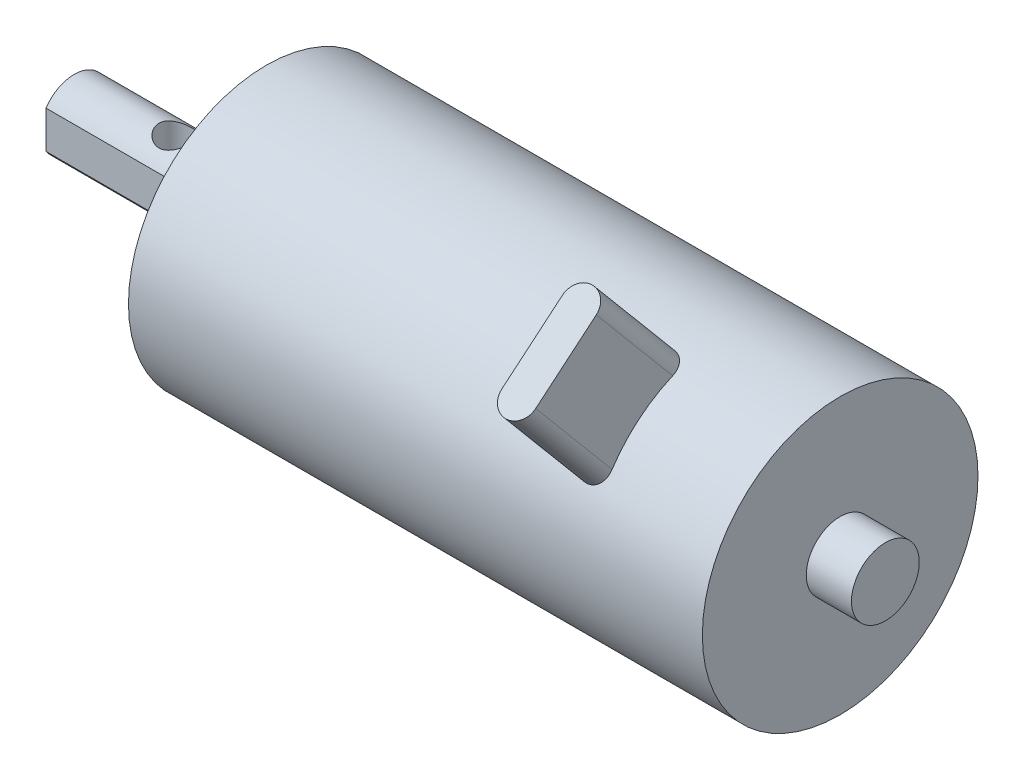
ISO-10303-21;
HEADER;
FILE_DESCRIPTION(('STEP AP214'),'2;1');
FILE_NAME('part.step','',(''),(''),'','','');
FILE_SCHEMA(('AUTOMOTIVE_DESIGN { 1 0 10303 214 1 1 1 1 }'));
ENDSEC;
DATA;
#1=APPLICATION_CONTEXT('core data for automotive mechanical design processes');
#2=APPLICATION_PROTOCOL_DEFINITION('international standard','automotive_design',2000,#1);
#3=PRODUCT_CONTEXT('',#1,'mechanical');
#4=PRODUCT('Part','Part','',(#3));
#5=PRODUCT_RELATED_PRODUCT_CATEGORY('part','',(#4));
#6=PRODUCT_DEFINITION_FORMATION('','',#4);
#7=PRODUCT_DEFINITION_CONTEXT('part definition',#1,'design');
#8=PRODUCT_DEFINITION('design','',#6,#7);
#9=PRODUCT_DEFINITION_SHAPE('','',#8);
#10=(LENGTH_UNIT() NAMED_UNIT(*) SI_UNIT(.MILLI.,.METRE.));
#11=(NAMED_UNIT(*) PLANE_ANGLE_UNIT() SI_UNIT($,.RADIAN.));
#12=(NAMED_UNIT(*) SI_UNIT($,.STERADIAN.) SOLID_ANGLE_UNIT());
#13=UNCERTAINTY_MEASURE_WITH_UNIT(LENGTH_MEASURE(1.E-05),#10,'distance_accuracy_value','');
#14=(GEOMETRIC_REPRESENTATION_CONTEXT(3) GLOBAL_UNCERTAINTY_ASSIGNED_CONTEXT((#13)) GLOBAL_UNIT_ASSIGNED_CONTEXT((#10,
#11,#12)) REPRESENTATION_CONTEXT('',''));
#15=CARTESIAN_POINT('',(0.,0.,0.));
#16=DIRECTION('',(0.,0.,1.));
#17=DIRECTION('',(1.,0.,0.));
#18=AXIS2_PLACEMENT_3D('',#15,#16,#17);
#19=CARTESIAN_POINT('',(-36.1518987341772,0.,0.));
#20=DIRECTION('',(-1.,0.,0.));
#21=DIRECTION('',(0.,0.,1.));
#22=AXIS2_PLACEMENT_3D('',#19,#20,#21);
#23=CYLINDRICAL_SURFACE('',#22,12.2);
#24=CARTESIAN_POINT('',(33.5686482187747,0.,0.));
#25=DIRECTION('',(-1.,0.,0.));
#26=DIRECTION('',(0.,0.,1.));
#27=AXIS2_PLACEMENT_3D('',#24,#25,#26);
#28=CIRCLE('',#27,12.2);
#29=CARTESIAN_POINT('',(33.5686482187747,0.,12.2));
#30=VERTEX_POINT('',#29);
#31=EDGE_CURVE('E168',#30,#30,#28,.T.);
#32=ORIENTED_EDGE('',*,*,#31,.T.);
#33=EDGE_LOOP('',(#32));
#34=FACE_BOUND('',#33,.T.);
#35=CARTESIAN_POINT('',(-17.2313517812253,0.,0.));
#36=DIRECTION('',(-1.,0.,0.));
#37=DIRECTION('',(0.,0.,1.));
#38=AXIS2_PLACEMENT_3D('',#35,#36,#37);
#39=CIRCLE('',#38,12.2);
#40=CARTESIAN_POINT('',(-17.2313517812253,0.,12.2));
#41=VERTEX_POINT('',#40);
#42=EDGE_CURVE('E171',#41,#41,#39,.T.);
#43=ORIENTED_EDGE('',*,*,#42,.F.);
#44=EDGE_LOOP('',(#43));
#45=FACE_BOUND('',#44,.T.);
#46=CARTESIAN_POINT('',(23.5686482187747,6.70313688125544,10.1935251974552));
#47=CARTESIAN_POINT('',(23.568647036408,6.66436642516747,10.2190219540229));
#48=CARTESIAN_POINT('',(23.5666712754832,6.62546962957114,10.2442809888455));
#49=CARTESIAN_POINT('',(23.5588239274405,6.54767741971779,10.2941755456539));
#50=CARTESIAN_POINT('',(23.552952960155,6.50878200622546,10.3188111661944));
#51=CARTESIAN_POINT('',(23.5295974692947,6.39256570298484,10.3915069588322));
#52=CARTESIAN_POINT('',(23.5063700508387,6.31560791400092,10.4384262158296));
#53=CARTESIAN_POINT('',(23.4453513214166,6.16512839330881,10.5280046016835));
#54=CARTESIAN_POINT('',(23.4075606179307,6.09160651842131,10.5706639081425));
#55=CARTESIAN_POINT('',(23.318335524122,5.95024076115301,10.6508797233694));
#56=CARTESIAN_POINT('',(23.2669006065871,5.88239709831147,10.6884360348728));
#57=CARTESIAN_POINT('',(23.1515120679318,5.75476626141769,10.757692495623));
#58=CARTESIAN_POINT('',(23.0875537312973,5.69498213643071,10.7893904302154));
#59=CARTESIAN_POINT('',(22.94859809677,5.58598704916432,10.8462222082018));
#60=CARTESIAN_POINT('',(22.8736019971563,5.53677494059261,10.8713567633073));
#61=CARTESIAN_POINT('',(22.7189595348809,5.45374127254246,10.9132377710523));
#62=CARTESIAN_POINT('',(22.6397887991631,5.41922754589515,10.9303664683995));
#63=CARTESIAN_POINT('',(22.4757607891449,5.36379340867553,10.9576772776205));
#64=CARTESIAN_POINT('',(22.3909145912908,5.34284732638927,10.96787251033));
#65=CARTESIAN_POINT('',(22.2657461958081,5.3231770625354,10.9774233804454));
#66=CARTESIAN_POINT('',(22.2264799880015,5.31856510500312,10.9796576135526));
#67=CARTESIAN_POINT('',(22.147699621081,5.3124112625009,10.9826360163077));
#68=CARTESIAN_POINT('',(22.1081858191756,5.31086567219003,10.9833819843535));
#69=CARTESIAN_POINT('',(22.0686482187747,5.3108666508632,10.9833826946323));
#70=B_SPLINE_CURVE_WITH_KNOTS('',3,(#46,#47,#48,#49,#50,#51,#52,#53,#54,#55,#56,#57,#58,#59,#60,
#61,#62,#63,#64,#65,#66,#67,#68,#69),.UNSPECIFIED.,.F.,.F.,(4,2,2,2,2,2,2,2,2,2,2,4),(0.,
0.139117984758654,0.27821383739904,0.556027022620829,0.833828620640015,1.11164095446973,
1.38955809641229,1.66744508939992,1.9301995855681,2.19245545309232,2.31112784927465,
2.42965675639252),.UNSPECIFIED.);
#71=CARTESIAN_POINT('',(23.5686482187747,6.70313688125544,10.1935251974552));
#72=VERTEX_POINT('',#71);
#73=CARTESIAN_POINT('',(22.0686482187747,5.3108666508632,10.9833826946323));
#74=VERTEX_POINT('',#73);
#75=EDGE_CURVE('E63',#72,#74,#70,.T.);
#76=ORIENTED_EDGE('',*,*,#75,.T.);
#77=CARTESIAN_POINT('',(22.0686482187747,5.3108666508632,10.9833826946323));
#78=CARTESIAN_POINT('',(22.0288737146961,5.31086404243873,10.9833826090815));
#79=CARTESIAN_POINT('',(21.9891196166211,5.31242924613729,10.9826272579866));
#80=CARTESIAN_POINT('',(21.9099228117034,5.31865455966664,10.9796143653024));
#81=CARTESIAN_POINT('',(21.870480020568,5.32331380044602,10.9773572455286));
#82=CARTESIAN_POINT('',(21.7533314460765,5.34181903892782,10.9683712377856));
#83=CARTESIAN_POINT('',(21.6764549668962,5.36019334620099,10.9594275027304));
#84=CARTESIAN_POINT('',(21.5273007518627,5.40808951007209,10.9358707218082));
#85=CARTESIAN_POINT('',(21.4550201926286,5.43760444388122,10.9212611965107));
#86=CARTESIAN_POINT('',(21.3166508316866,5.50646852247127,10.8867021861893));
#87=CARTESIAN_POINT('',(21.2505661223796,5.54582410501915,10.8667492048592));
#88=CARTESIAN_POINT('',(21.1233494466656,5.63469694781062,10.8209420672849));
#89=CARTESIAN_POINT('',(21.0625483221439,5.68457562771626,10.7948727597828));
#90=CARTESIAN_POINT('',(20.9503743105202,5.7916030232241,10.7378308228955));
#91=CARTESIAN_POINT('',(20.8990049397399,5.84875443683801,10.706856372771));
#92=CARTESIAN_POINT('',(20.8029754172839,5.97333305281737,10.6378918094933));
#93=CARTESIAN_POINT('',(20.759163569708,6.04121516401551,10.5995411035256));
#94=CARTESIAN_POINT('',(20.6845341424084,6.181340354576,10.5184402536808));
#95=CARTESIAN_POINT('',(20.6537149876935,6.25358290414591,10.4756906438266));
#96=CARTESIAN_POINT('',(20.6095933374536,6.38884108529308,10.3936482386368));
#97=CARTESIAN_POINT('',(20.594300384776,6.45152463123381,10.3548664623744));
#98=CARTESIAN_POINT('',(20.5738223666413,6.57730613486213,10.2754405821694));
#99=CARTESIAN_POINT('',(20.5686315566217,6.64040383654517,10.2347975500932));
#100=CARTESIAN_POINT('',(20.5686482187747,6.70313688125544,10.1935251974552));
#101=B_SPLINE_CURVE_WITH_KNOTS('',3,(#77,#78,#79,#80,#81,#82,#83,#84,#85,#86,#87,#88,#89,#90,
#91,#92,#93,#94,#95,#96,#97,#98,#99,#100),.UNSPECIFIED.,.F.,.F.,(4,2,2,2,2,2,2,2,2,2,2,4),(0.,
0.119245742061401,0.238458004604423,0.475845193065005,0.713085111252849,0.950480640078595,
1.1979875842481,1.44558661677027,1.71270719841277,1.9797953900324,2.20495063321569,
2.42997780488635),.UNSPECIFIED.);
#102=CARTESIAN_POINT('',(20.5686482187747,6.70313688125544,10.1935251974552));
#103=VERTEX_POINT('',#102);
#104=EDGE_CURVE('E261',#74,#103,#101,.T.);
#105=ORIENTED_EDGE('',*,*,#104,.T.);
#106=CARTESIAN_POINT('',(20.5686482187747,0.,0.));
#107=DIRECTION('',(-1.,0.,0.));
#108=DIRECTION('',(0.,0.,1.));
#109=AXIS2_PLACEMENT_3D('',#106,#107,#108);
#110=CIRCLE('',#109,12.2);
#111=CARTESIAN_POINT('',(20.5686482187747,11.2026501490612,4.83121409562228));
#112=VERTEX_POINT('',#111);
#113=EDGE_CURVE('E307',#103,#112,#110,.T.);
#114=ORIENTED_EDGE('',*,*,#113,.T.);
#115=CARTESIAN_POINT('',(20.5686482187747,11.2026501490612,4.83121409562228));
#116=CARTESIAN_POINT('',(20.5686494011413,11.2210271335588,4.78860518456461));
#117=CARTESIAN_POINT('',(20.5706251620661,11.2391480692133,4.74591313332745));
#118=CARTESIAN_POINT('',(20.5784725101088,11.2747761401136,4.66063866307464));
#119=CARTESIAN_POINT('',(20.5843434773943,11.2922833725496,4.61805622769823));
#120=CARTESIAN_POINT('',(20.6076989682546,11.3436940034778,4.49098201932483));
#121=CARTESIAN_POINT('',(20.6309263867106,11.37653687172,4.40704594860372));
#122=CARTESIAN_POINT('',(20.6919451161327,11.4386238660669,4.24329742649468));
#123=CARTESIAN_POINT('',(20.7297358196186,11.467868142213,4.16348480326234));
#124=CARTESIAN_POINT('',(20.8189609134274,11.5223173928284,4.01033737935986));
#125=CARTESIAN_POINT('',(20.8703958309622,11.5475222111529,3.9370028291483));
#126=CARTESIAN_POINT('',(20.9857843696176,11.5935636484052,3.79928473325093));
#127=CARTESIAN_POINT('',(21.049742706252,11.6143986157888,3.73490457487893));
#128=CARTESIAN_POINT('',(21.1886983407793,11.6514401930888,3.61769663321783));
#129=CARTESIAN_POINT('',(21.263694440393,11.6676473048526,3.5648675974638));
#130=CARTESIAN_POINT('',(21.4183369026684,11.694473400842,3.4758228367332));
#131=CARTESIAN_POINT('',(21.4975076383862,11.7053486290516,3.43885908406544));
#132=CARTESIAN_POINT('',(21.6615356484044,11.7226184888049,3.37952464369817));
#133=CARTESIAN_POINT('',(21.7463818462585,11.7290215840026,3.35712639588654));
#134=CARTESIAN_POINT('',(21.8715502417412,11.7350116494678,3.33609647634877));
#135=CARTESIAN_POINT('',(21.9108164495478,11.7364110815328,3.33116661430689));
#136=CARTESIAN_POINT('',(21.9895968164684,11.7382756321215,3.3245890682891));
#137=CARTESIAN_POINT('',(22.0291106183737,11.7387418782956,3.32293742297622));
#138=CARTESIAN_POINT('',(22.0686482187747,11.7387427477285,3.32293826344252));
#139=B_SPLINE_CURVE_WITH_KNOTS('',3,(#115,#116,#117,#118,#119,#120,#121,#122,#123,#124,#125,
#126,#127,#128,#129,#130,#131,#132,#133,#134,#135,#136,#137,#138),.UNSPECIFIED.,.F.,.F.,(4,2,2,
2,2,2,2,2,2,2,2,4),(0.,0.139117984758655,0.278213837399041,0.556027022620832,0.83382862064002,
1.11164095446973,1.3895580964123,1.66744508939993,1.93019958556811,2.19245545309233,
2.31112784927466,2.42965675639252),.UNSPECIFIED.);
#140=CARTESIAN_POINT('',(22.0686482187747,11.7387427477285,3.32293826344252));
#141=VERTEX_POINT('',#140);
#142=EDGE_CURVE('E11',#112,#141,#139,.T.);
#143=ORIENTED_EDGE('',*,*,#142,.T.);
#144=CARTESIAN_POINT('',(22.0686482187747,11.7387427477285,3.32293826344252));
#145=CARTESIAN_POINT('',(22.1084227228532,11.7387422105292,3.32293570950162));
#146=CARTESIAN_POINT('',(22.1481768209282,11.7382701296847,3.32460829958013));
#147=CARTESIAN_POINT('',(22.2273736258459,11.7363840239601,3.33126221993288));
#148=CARTESIAN_POINT('',(22.2668164169813,11.734970263578,3.33624262111107));
#149=CARTESIAN_POINT('',(22.3839649914728,11.7293341744238,3.35602712730836));
#150=CARTESIAN_POINT('',(22.4608414706532,11.7237169797743,3.37567535086108));
#151=CARTESIAN_POINT('',(22.6099956856866,11.7088351608596,3.42693445645972));
#152=CARTESIAN_POINT('',(22.6822762449207,11.6995728015488,3.45853790954907));
#153=CARTESIAN_POINT('',(22.8206456058628,11.6774969420016,3.5323568972129));
#154=CARTESIAN_POINT('',(22.8867303151697,11.6646811164825,3.57457937887735));
#155=CARTESIAN_POINT('',(23.0139469908837,11.6350024994509,3.67005636945454));
#156=CARTESIAN_POINT('',(23.0747481154054,11.6179905851772,3.72370416787641));
#157=CARTESIAN_POINT('',(23.1869221270291,11.5804003556741,3.83901080514831));
#158=CARTESIAN_POINT('',(23.2382914978094,11.5598207158714,3.90067261718924));
#159=CARTESIAN_POINT('',(23.3343210202654,11.5135367289135,4.03533417480202));
#160=CARTESIAN_POINT('',(23.3781328678414,11.4875562612488,4.10884453440431));
#161=CARTESIAN_POINT('',(23.4527622951409,11.4320199995318,4.26092392324339));
#162=CARTESIAN_POINT('',(23.4835814498558,11.402464639392,4.33949233800436));
#163=CARTESIAN_POINT('',(23.5277031000958,11.345155979356,4.48694215760904));
#164=CARTESIAN_POINT('',(23.5429960527733,11.3178482689395,4.55540778441242));
#165=CARTESIAN_POINT('',(23.5634740709081,11.2614707752131,4.69307054372831));
#166=CARTESIAN_POINT('',(23.5686648809276,11.2324020030308,4.76226723799791));
#167=CARTESIAN_POINT('',(23.5686482187747,11.2026501490612,4.83121409562228));
#168=B_SPLINE_CURVE_WITH_KNOTS('',3,(#144,#145,#146,#147,#148,#149,#150,#151,#152,#153,#154,
#155,#156,#157,#158,#159,#160,#161,#162,#163,#164,#165,#166,#167),.UNSPECIFIED.,.F.,.F.,(4,2,2,
2,2,2,2,2,2,2,2,4),(0.,0.119245742061397,0.238458004604423,0.475845193065005,0.713085111252848,
0.950480640078595,1.19798758424811,1.44558661677027,1.71270719841277,1.9797953900324,
2.20495063321569,2.42997780488635),.UNSPECIFIED.);
#169=CARTESIAN_POINT('',(23.5686482187747,11.2026501490612,4.83121409562228));
#170=VERTEX_POINT('',#169);
#171=EDGE_CURVE('E50',#141,#170,#168,.T.);
#172=ORIENTED_EDGE('',*,*,#171,.T.);
#173=CARTESIAN_POINT('',(23.5686482187747,0.,0.));
#174=DIRECTION('',(-1.,0.,0.));
#175=DIRECTION('',(0.,0.,1.));
#176=AXIS2_PLACEMENT_3D('',#173,#174,#175);
#177=CIRCLE('',#176,12.2);
#178=EDGE_CURVE('E309',#72,#170,#177,.T.);
#179=ORIENTED_EDGE('',*,*,#178,.F.);
#180=EDGE_LOOP('',(#76,#105,#114,#143,#172,#179));
#181=FACE_BOUND('',#180,.T.);
#182=ADVANCED_FACE('F40',(#34,#45,#181),#23,.T.);
#183=CARTESIAN_POINT('',(-36.1518987341772,0.,0.));
#184=DIRECTION('',(-1.,0.,0.));
#185=DIRECTION('',(0.,0.,1.));
#186=AXIS2_PLACEMENT_3D('',#183,#184,#185);
#187=CYLINDRICAL_SURFACE('',#186,3.);
#188=CARTESIAN_POINT('',(-22.7313517812253,0.,0.));
#189=DIRECTION('',(-1.,0.,0.));
#190=DIRECTION('',(0.,0.,1.));
#191=AXIS2_PLACEMENT_3D('',#188,#189,#190);
#192=CIRCLE('',#191,3.);
#193=CARTESIAN_POINT('',(-22.7313517812253,-1.6583123951777,2.5));
#194=VERTEX_POINT('',#193);
#195=CARTESIAN_POINT('',(-22.7313517812253,1.6583123951777,2.5));
#196=VERTEX_POINT('',#195);
#197=EDGE_CURVE('E303',#194,#196,#192,.T.);
#198=ORIENTED_EDGE('',*,*,#197,.F.);
#199=DIRECTION('',(-1.,0.,0.));
#200=VECTOR('',#199,1.);
#201=CARTESIAN_POINT('',(-36.1518987341772,-1.6583123951777,2.5));
#202=LINE('',#201,#200);
#203=CARTESIAN_POINT('',(-34.2313517812253,-1.6583123951777,2.5));
#204=VERTEX_POINT('',#203);
#205=EDGE_CURVE('E139',#194,#204,#202,.T.);
#206=ORIENTED_EDGE('',*,*,#205,.T.);
#207=CARTESIAN_POINT('',(-34.2313517812253,0.,0.));
#208=DIRECTION('',(-1.,0.,0.));
#209=DIRECTION('',(0.,0.,1.));
#210=AXIS2_PLACEMENT_3D('',#207,#208,#209);
#211=CIRCLE('',#210,3.);
#212=CARTESIAN_POINT('',(-34.2313517812253,1.6583123951777,2.5));
#213=VERTEX_POINT('',#212);
#214=EDGE_CURVE('E183',#213,#204,#211,.T.);
#215=ORIENTED_EDGE('',*,*,#214,.F.);
#216=DIRECTION('',(-1.,0.,0.));
#217=VECTOR('',#216,1.);
#218=CARTESIAN_POINT('',(-36.1518987341772,1.6583123951777,2.5));
#219=LINE('',#218,#217);
#220=EDGE_CURVE('E130',#213,#196,#219,.F.);
#221=ORIENTED_EDGE('',*,*,#220,.T.);
#222=EDGE_LOOP('',(#198,#206,#215,#221));
#223=FACE_BOUND('',#222,.T.);
#224=CARTESIAN_POINT('',(-19.8313517812253,0.,0.));
#225=DIRECTION('',(-1.,0.,0.));
#226=DIRECTION('',(0.,0.,1.));
#227=AXIS2_PLACEMENT_3D('',#224,#225,#226);
#228=CIRCLE('',#227,3.);
#229=CARTESIAN_POINT('',(-19.8313517812253,0.,3.));
#230=VERTEX_POINT('',#229);
#231=EDGE_CURVE('E180',#230,#230,#228,.T.);
#232=ORIENTED_EDGE('',*,*,#231,.T.);
#233=EDGE_LOOP('',(#232));
#234=FACE_BOUND('',#233,.T.);
#235=CARTESIAN_POINT('',(-25.2313517812253,-2.59807621135332,-1.5));
#236=CARTESIAN_POINT('',(-25.1531900689325,-2.59808302092689,-1.4999945446118));
#237=CARTESIAN_POINT('',(-25.0749296639378,-2.60165701781635,-1.49384995609983));
#238=CARTESIAN_POINT('',(-24.9208108842096,-2.61543549678079,-1.46958481484708));
#239=CARTESIAN_POINT('',(-24.8449579086602,-2.62565391083339,-1.45143909683127));
#240=CARTESIAN_POINT('',(-24.6981742847094,-2.65124019908098,-1.40414992304972));
#241=CARTESIAN_POINT('',(-24.627219802515,-2.66658065209878,-1.3750649287406));
#242=CARTESIAN_POINT('',(-24.4912154782303,-2.70063997225287,-1.30690128806456));
#243=CARTESIAN_POINT('',(-24.4261659558317,-2.71935902214097,-1.26782210105366));
#244=CARTESIAN_POINT('',(-24.2978931883891,-2.75995303586162,-1.17699981079632));
#245=CARTESIAN_POINT('',(-24.235263077715,-2.7819609545693,-1.12447805421566));
#246=CARTESIAN_POINT('',(-24.1192391986153,-2.82557974178559,-1.0098807114217));
#247=CARTESIAN_POINT('',(-24.0658500373501,-2.84719040746875,-0.94780038867344));
#248=CARTESIAN_POINT('',(-23.9663010545038,-2.88932215429424,-0.81073434512182));
#249=CARTESIAN_POINT('',(-23.920871129436,-2.90967159627259,-0.735160783518864));
#250=CARTESIAN_POINT('',(-23.8436405013567,-2.94526134149293,-0.576235539899258));
#251=CARTESIAN_POINT('',(-23.8118311970196,-2.96050486775612,-0.492888807207235));
#252=CARTESIAN_POINT('',(-23.7650947892737,-2.98320691866356,-0.327067415888968));
#253=CARTESIAN_POINT('',(-23.749127491692,-2.99114220331338,-0.244952685733228));
#254=CARTESIAN_POINT('',(-23.7311026032128,-3.00011375769101,-0.0788559430467736));
#255=CARTESIAN_POINT('',(-23.7290365960318,-3.00115420176885,0.00512490876560668));
#256=CARTESIAN_POINT('',(-23.7384717921809,-2.99644472874675,0.164748786635624));
#257=CARTESIAN_POINT('',(-23.7488088045072,-2.99127743838241,0.240481798765186));
#258=CARTESIAN_POINT('',(-23.7806730470823,-2.97561367889621,0.388970657877482));
#259=CARTESIAN_POINT('',(-23.8022011146897,-2.96511681099591,0.461726281640887));
#260=CARTESIAN_POINT('',(-23.8559756303601,-2.93957374931482,0.603464087354329));
#261=CARTESIAN_POINT('',(-23.8883662509834,-2.92446662293799,0.672380135272766));
#262=CARTESIAN_POINT('',(-23.9627469055276,-2.89106468980031,0.803965202269992));
#263=CARTESIAN_POINT('',(-24.0047403761789,-2.87276874236226,0.866631973257968));
#264=CARTESIAN_POINT('',(-24.1016948085249,-2.83266591598844,0.990260491347291));
#265=CARTESIAN_POINT('',(-24.1575063237144,-2.81069063997263,1.05050111254404));
#266=CARTESIAN_POINT('',(-24.2782363686206,-2.76681510880218,1.16115655544667));
#267=CARTESIAN_POINT('',(-24.3431618396364,-2.74491492398443,1.21156381736135));
#268=CARTESIAN_POINT('',(-24.4853240698615,-2.70216234138727,1.30425800196332));
#269=CARTESIAN_POINT('',(-24.5630808158067,-2.68146479986061,1.34582597246708));
#270=CARTESIAN_POINT('',(-24.7257582882638,-2.64563175417864,1.41497866950185));
#271=CARTESIAN_POINT('',(-24.8106714307517,-2.63049045069101,1.44257798731633));
#272=CARTESIAN_POINT('',(-24.9781735481495,-2.60916953725552,1.48077031653756));
#273=CARTESIAN_POINT('',(-25.0604134597907,-2.60237483772745,1.49253768317996));
#274=CARTESIAN_POINT('',(-25.2259537935001,-2.59676879042414,1.50227541991714));
#275=CARTESIAN_POINT('',(-25.309253424905,-2.59795180333967,1.50025553597254));
#276=CARTESIAN_POINT('',(-25.4648326590934,-2.60751504810877,1.48355406501595));
#277=CARTESIAN_POINT('',(-25.5373209578872,-2.61509381259981,1.4702817250687));
#278=CARTESIAN_POINT('',(-25.6789034606318,-2.63541032327012,1.43354442694866));
#279=CARTESIAN_POINT('',(-25.7479965573453,-2.64814974007551,1.41007616793542));
#280=CARTESIAN_POINT('',(-25.8844687775794,-2.67804333119485,1.35247138290733));
#281=CARTESIAN_POINT('',(-25.9516203065057,-2.69537464864595,1.31789109553909));
#282=CARTESIAN_POINT('',(-26.0795556885338,-2.73234179245875,1.23943059602371));
#283=CARTESIAN_POINT('',(-26.1403362464953,-2.75197880032721,1.19554560649832));
#284=CARTESIAN_POINT('',(-26.2618199325107,-2.79431997684504,1.09325575079828));
#285=CARTESIAN_POINT('',(-26.3215475073018,-2.81709874731434,1.03371790847245));
#286=CARTESIAN_POINT('',(-26.4304701382157,-2.86101352466839,0.905106743097433));
#287=CARTESIAN_POINT('',(-26.4796616365711,-2.88214897511564,0.836030211983021));
#288=CARTESIAN_POINT('',(-26.5672123701505,-2.92112042536435,0.687803043838137));
#289=CARTESIAN_POINT('',(-26.6052514585417,-2.93885462508044,0.608434646361171));
#290=CARTESIAN_POINT('',(-26.6670586370114,-2.96825032438951,0.443283546961624));
#291=CARTESIAN_POINT('',(-26.6908392582748,-2.9799171551456,0.357506552088265));
#292=CARTESIAN_POINT('',(-26.7214046274873,-2.99501262272824,0.190469523495626));
#293=CARTESIAN_POINT('',(-26.7295485950395,-2.99909891862287,0.109517165775686));
#294=CARTESIAN_POINT('',(-26.7326166794069,-3.00063195562697,-0.0526889789268054));
#295=CARTESIAN_POINT('',(-26.7275454240107,-2.99808102100335,-0.13394265044263));
#296=CARTESIAN_POINT('',(-26.7052271710319,-2.98700953256884,-0.288806988475721));
#297=CARTESIAN_POINT('',(-26.6888045073388,-2.97889342001985,-0.362568476716896));
#298=CARTESIAN_POINT('',(-26.6453612822709,-2.95788140495135,-0.506168928275427));
#299=CARTESIAN_POINT('',(-26.6183392010852,-2.94498481699194,-0.576007327433263));
#300=CARTESIAN_POINT('',(-26.5532612029764,-2.9148889612218,-0.713135109367328));
#301=CARTESIAN_POINT('',(-26.5147827964136,-2.89752925798199,-0.780187714050071));
#302=CARTESIAN_POINT('',(-26.4284148849368,-2.86032199712739,-0.907161962721039));
#303=CARTESIAN_POINT('',(-26.3805210575518,-2.84047329837541,-0.967080311122361));
#304=CARTESIAN_POINT('',(-26.2711560726913,-2.79792915339941,-1.08437100623534));
#305=CARTESIAN_POINT('',(-26.2088080500096,-2.77514698517547,-1.14089652680891));
#306=CARTESIAN_POINT('',(-26.0751756995307,-2.73094614244278,-1.24299493109201));
#307=CARTESIAN_POINT('',(-26.0038835499238,-2.70952868642798,-1.28855812501509));
#308=CARTESIAN_POINT('',(-25.8513968113539,-2.66999407957374,-1.36864661967848));
#309=CARTESIAN_POINT('',(-25.7699604845322,-2.65200261384405,-1.40277759894141));
#310=CARTESIAN_POINT('',(-25.6013531747157,-2.62299234492527,-1.45631806425962));
#311=CARTESIAN_POINT('',(-25.5142024478563,-2.61195024221553,-1.47577678676302));
#312=CARTESIAN_POINT('',(-25.3936437477473,-2.60293908902686,-1.49155051179662));
#313=CARTESIAN_POINT('',(-25.3612999396285,-2.60112193507728,-1.49471415744578));
#314=CARTESIAN_POINT('',(-25.296427060202,-2.59868903831625,-1.49894010763495));
#315=CARTESIAN_POINT('',(-25.2638979766465,-2.59807337587664,-1.50000227159981));
#316=CARTESIAN_POINT('',(-25.2313517812253,-2.59807621135332,-1.5));
#317=B_SPLINE_CURVE_WITH_KNOTS('',3,(#235,#236,#237,#238,#239,#240,#241,#242,#243,#244,#245,
#246,#247,#248,#249,#250,#251,#252,#253,#254,#255,#256,#257,#258,#259,#260,#261,#262,#263,#264,
#265,#266,#267,#268,#269,#270,#271,#272,#273,#274,#275,#276,#277,#278,#279,#280,#281,#282,#283,
#284,#285,#286,#287,#288,#289,#290,#291,#292,#293,#294,#295,#296,#297,#298,#299,#300,#301,#302,
#303,#304,#305,#306,#307,#308,#309,#310,#311,#312,#313,#314,#315,#316),.UNSPECIFIED.,.T.,.F.,(4,
2,2,2,2,2,2,2,2,2,2,2,2,2,2,2,2,2,2,2,2,2,2,2,2,2,2,2,2,2,2,2,2,2,2,2,2,2,2,2,4),(0.,
0.234348183892075,0.469189339237207,0.702792893878327,0.936409088167727,1.18929346874735,
1.44230356626557,1.71236838358145,1.98226240445836,2.23295227451903,2.4834903552906,
2.71224146226808,2.94100968776183,3.1729430209672,3.40495949025408,3.65890787185336,
3.91305072368878,4.18333262594172,4.45333161317557,4.70193436281317,4.95036139782559,
5.17161275136038,5.39293578654094,5.62450944609132,5.85620229330071,6.1171011537092,
6.37808797467303,6.64596272119449,6.91360169713157,7.1566840558423,7.39968130190957,
7.62666637307239,7.85368400268019,8.09041126079208,8.32724745151079,8.58765362775101,
8.84828914267731,9.11716123557908,9.3851269950414,9.48270202777964,9.58028358741811),.UNSPECIFIED.);
#318=CARTESIAN_POINT('',(-25.2313517812253,-2.59807621135332,-1.5));
#319=VERTEX_POINT('',#318);
#320=EDGE_CURVE('E142',#319,#319,#317,.T.);
#321=ORIENTED_EDGE('',*,*,#320,.F.);
#322=EDGE_LOOP('',(#321));
#323=FACE_BOUND('',#322,.T.);
#324=CARTESIAN_POINT('',(-25.2313517812253,2.59807621135332,-1.5));
#325=CARTESIAN_POINT('',(-25.3095134935182,2.59808302092689,-1.4999945446118));
#326=CARTESIAN_POINT('',(-25.3877738985129,2.60165701781635,-1.49384995609983));
#327=CARTESIAN_POINT('',(-25.5418926782411,2.61543549678079,-1.46958481484708));
#328=CARTESIAN_POINT('',(-25.6177456537905,2.62565391083339,-1.45143909683127));
#329=CARTESIAN_POINT('',(-25.7645292777413,2.65124019908098,-1.40414992304972));
#330=CARTESIAN_POINT('',(-25.8354837599357,2.66658065209878,-1.3750649287406));
#331=CARTESIAN_POINT('',(-25.9714880842204,2.70063997225287,-1.30690128806456));
#332=CARTESIAN_POINT('',(-26.036537606619,2.71935902214097,-1.26782210105366));
#333=CARTESIAN_POINT('',(-26.1648103740616,2.75995303586162,-1.17699981079632));
#334=CARTESIAN_POINT('',(-26.2274404847357,2.7819609545693,-1.12447805421566));
#335=CARTESIAN_POINT('',(-26.3434643638354,2.82557974178559,-1.0098807114217));
#336=CARTESIAN_POINT('',(-26.3968535251006,2.84719040746875,-0.94780038867344));
#337=CARTESIAN_POINT('',(-26.4964025079468,2.88932215429424,-0.81073434512182));
#338=CARTESIAN_POINT('',(-26.5418324330146,2.90967159627259,-0.735160783518864));
#339=CARTESIAN_POINT('',(-26.619063061094,2.94526134149293,-0.576235539899258));
#340=CARTESIAN_POINT('',(-26.6508723654311,2.96050486775612,-0.492888807207235));
#341=CARTESIAN_POINT('',(-26.697608773177,2.98320691866356,-0.327067415888968));
#342=CARTESIAN_POINT('',(-26.7135760707586,2.99114220331338,-0.244952685733228));
#343=CARTESIAN_POINT('',(-26.7316009592379,3.00011375769101,-0.0788559430467736));
#344=CARTESIAN_POINT('',(-26.7336669664189,3.00115420176885,0.00512490876560667));
#345=CARTESIAN_POINT('',(-26.7242317702698,2.99644472874675,0.164748786635624));
#346=CARTESIAN_POINT('',(-26.7138947579435,2.99127743838241,0.240481798765186));
#347=CARTESIAN_POINT('',(-26.6820305153684,2.97561367889621,0.388970657877482));
#348=CARTESIAN_POINT('',(-26.660502447761,2.96511681099591,0.461726281640887));
#349=CARTESIAN_POINT('',(-26.6067279320906,2.93957374931482,0.60346408735433));
#350=CARTESIAN_POINT('',(-26.5743373114672,2.92446662293799,0.672380135272768));
#351=CARTESIAN_POINT('',(-26.4999566569231,2.89106468980031,0.803965202269993));
#352=CARTESIAN_POINT('',(-26.4579631862718,2.87276874236226,0.866631973257968));
#353=CARTESIAN_POINT('',(-26.3610087539258,2.83266591598844,0.990260491347292));
#354=CARTESIAN_POINT('',(-26.3051972387363,2.81069063997263,1.05050111254404));
#355=CARTESIAN_POINT('',(-26.1844671938301,2.76681510880217,1.16115655544667));
#356=CARTESIAN_POINT('',(-26.1195417228142,2.74491492398443,1.21156381736135));
#357=CARTESIAN_POINT('',(-25.9773794925892,2.70216234138727,1.30425800196332));
#358=CARTESIAN_POINT('',(-25.899622746644,2.68146479986061,1.34582597246708));
#359=CARTESIAN_POINT('',(-25.7369452741868,2.64563175417864,1.41497866950185));
#360=CARTESIAN_POINT('',(-25.652032131699,2.63049045069101,1.44257798731633));
#361=CARTESIAN_POINT('',(-25.4845300143012,2.60916953725552,1.48077031653756));
#362=CARTESIAN_POINT('',(-25.40229010266,2.60237483772745,1.49253768317996));
#363=CARTESIAN_POINT('',(-25.2367497689505,2.59676879042414,1.50227541991714));
#364=CARTESIAN_POINT('',(-25.1534501375457,2.59795180333967,1.50025553597254));
#365=CARTESIAN_POINT('',(-24.9978709033573,2.60751504810877,1.48355406501595));
#366=CARTESIAN_POINT('',(-24.9253826045635,2.61509381259981,1.4702817250687));
#367=CARTESIAN_POINT('',(-24.7838001018189,2.63541032327012,1.43354442694866));
#368=CARTESIAN_POINT('',(-24.7147070051054,2.64814974007551,1.41007616793542));
#369=CARTESIAN_POINT('',(-24.5782347848713,2.67804333119485,1.35247138290733));
#370=CARTESIAN_POINT('',(-24.511083255945,2.69537464864595,1.31789109553908));
#371=CARTESIAN_POINT('',(-24.3831478739169,2.73234179245875,1.23943059602371));
#372=CARTESIAN_POINT('',(-24.3223673159554,2.75197880032721,1.19554560649832));
#373=CARTESIAN_POINT('',(-24.20088362994,2.79431997684504,1.09325575079828));
#374=CARTESIAN_POINT('',(-24.1411560551489,2.81709874731434,1.03371790847245));
#375=CARTESIAN_POINT('',(-24.032233424235,2.86101352466839,0.905106743097434));
#376=CARTESIAN_POINT('',(-23.9830419258795,2.88214897511564,0.836030211983021));
#377=CARTESIAN_POINT('',(-23.8954911923002,2.92112042536435,0.687803043838137));
#378=CARTESIAN_POINT('',(-23.857452103909,2.93885462508044,0.608434646361171));
#379=CARTESIAN_POINT('',(-23.7956449254393,2.96825032438951,0.443283546961624));
#380=CARTESIAN_POINT('',(-23.7718643041759,2.9799171551456,0.357506552088265));
#381=CARTESIAN_POINT('',(-23.7412989349633,2.99501262272824,0.190469523495626));
#382=CARTESIAN_POINT('',(-23.7331549674112,2.99909891862287,0.109517165775686));
#383=CARTESIAN_POINT('',(-23.7300868830437,3.00063195562697,-0.0526889789268054));
#384=CARTESIAN_POINT('',(-23.73515813844,2.99808102100335,-0.13394265044263));
#385=CARTESIAN_POINT('',(-23.7574763914188,2.98700953256884,-0.288806988475721));
#386=CARTESIAN_POINT('',(-23.7738990551118,2.97889342001985,-0.362568476716896));
#387=CARTESIAN_POINT('',(-23.8173422801798,2.95788140495135,-0.506168928275427));
#388=CARTESIAN_POINT('',(-23.8443643613655,2.94498481699194,-0.576007327433263));
#389=CARTESIAN_POINT('',(-23.9094423594743,2.9148889612218,-0.713135109367327));
#390=CARTESIAN_POINT('',(-23.9479207660371,2.89752925798199,-0.780187714050069));
#391=CARTESIAN_POINT('',(-24.0342886775139,2.86032199712739,-0.907161962721037));
#392=CARTESIAN_POINT('',(-24.0821825048988,2.84047329837541,-0.967080311122361));
#393=CARTESIAN_POINT('',(-24.1915474897594,2.79792915339941,-1.08437100623534));
#394=CARTESIAN_POINT('',(-24.2538955124411,2.77514698517547,-1.14089652680891));
#395=CARTESIAN_POINT('',(-24.38752786292,2.73094614244278,-1.24299493109201));
#396=CARTESIAN_POINT('',(-24.4588200125269,2.70952868642798,-1.28855812501509));
#397=CARTESIAN_POINT('',(-24.6113067510968,2.66999407957374,-1.36864661967848));
#398=CARTESIAN_POINT('',(-24.6927430779184,2.65200261384405,-1.40277759894141));
#399=CARTESIAN_POINT('',(-24.861350387735,2.62299234492527,-1.45631806425962));
#400=CARTESIAN_POINT('',(-24.9485011145944,2.61195024221553,-1.47577678676302));
#401=CARTESIAN_POINT('',(-25.0690598147033,2.60293908902686,-1.49155051179662));
#402=CARTESIAN_POINT('',(-25.1014036228222,2.60112193507728,-1.49471415744578));
#403=CARTESIAN_POINT('',(-25.1662765022487,2.59868903831625,-1.49894010763495));
#404=CARTESIAN_POINT('',(-25.1988055858041,2.59807337587664,-1.50000227159981));
#405=CARTESIAN_POINT('',(-25.2313517812253,2.59807621135332,-1.5));
#406=B_SPLINE_CURVE_WITH_KNOTS('',3,(#324,#325,#326,#327,#328,#329,#330,#331,#332,#333,#334,
#335,#336,#337,#338,#339,#340,#341,#342,#343,#344,#345,#346,#347,#348,#349,#350,#351,#352,#353,
#354,#355,#356,#357,#358,#359,#360,#361,#362,#363,#364,#365,#366,#367,#368,#369,#370,#371,#372,
#373,#374,#375,#376,#377,#378,#379,#380,#381,#382,#383,#384,#385,#386,#387,#388,#389,#390,#391,
#392,#393,#394,#395,#396,#397,#398,#399,#400,#401,#402,#403,#404,#405),.UNSPECIFIED.,.T.,.F.,(4,
2,2,2,2,2,2,2,2,2,2,2,2,2,2,2,2,2,2,2,2,2,2,2,2,2,2,2,2,2,2,2,2,2,2,2,2,2,2,2,4),(0.,
0.234348183892075,0.469189339237207,0.702792893878327,0.936409088167727,1.18929346874735,
1.44230356626557,1.71236838358145,1.98226240445836,2.23295227451903,2.4834903552906,
2.71224146226808,2.94100968776183,3.1729430209672,3.40495949025408,3.65890787185336,
3.91305072368878,4.18333262594172,4.45333161317557,4.70193436281318,4.95036139782559,
5.17161275136038,5.39293578654094,5.62450944609132,5.85620229330071,6.1171011537092,
6.37808797467303,6.64596272119449,6.91360169713157,7.1566840558423,7.39968130190958,
7.62666637307239,7.8536840026802,8.09041126079208,8.32724745151079,8.58765362775102,
8.84828914267731,9.11716123557907,9.38512699504141,9.48270202777964,9.58028358741811),.UNSPECIFIED.);
#407=CARTESIAN_POINT('',(-25.2313517812253,2.59807621135332,-1.5));
#408=VERTEX_POINT('',#407);
#409=EDGE_CURVE('E147',#408,#408,#406,.T.);
#410=ORIENTED_EDGE('',*,*,#409,.F.);
#411=EDGE_LOOP('',(#410));
#412=FACE_BOUND('',#411,.T.);
#413=ADVANCED_FACE('F196',(#223,#234,#323,#412),#187,.T.);
#414=CARTESIAN_POINT('',(-34.2313517812253,0.,0.));
#415=DIRECTION('',(1.,0.,0.));
#416=DIRECTION('',(0.,0.,-1.));
#417=AXIS2_PLACEMENT_3D('',#414,#415,#416);
#418=PLANE('',#417);
#419=CARTESIAN_POINT('',(-34.2313517812253,0.,0.));
#420=DIRECTION('',(-1.,0.,0.));
#421=DIRECTION('',(0.,0.,1.));
#422=AXIS2_PLACEMENT_3D('',#419,#420,#421);
#423=CIRCLE('',#422,1.24999999999999);
#424=CARTESIAN_POINT('',(-34.2313517812253,0.,1.24999999999999));
#425=VERTEX_POINT('',#424);
#426=EDGE_CURVE('E127',#425,#425,#423,.T.);
#427=ORIENTED_EDGE('',*,*,#426,.F.);
#428=EDGE_LOOP('',(#427));
#429=FACE_BOUND('',#428,.T.);
#430=ORIENTED_EDGE('',*,*,#214,.T.);
#431=DIRECTION('',(0.,1.,0.));
#432=VECTOR('',#431,1.);
#433=CARTESIAN_POINT('',(-34.2313517812253,0.,2.5));
#434=LINE('',#433,#432);
#435=EDGE_CURVE('E186',#204,#213,#434,.T.);
#436=ORIENTED_EDGE('',*,*,#435,.T.);
#437=EDGE_LOOP('',(#430,#436));
#438=FACE_BOUND('',#437,.T.);
#439=ADVANCED_FACE('F286',(#429,#438),#418,.F.);
#440=CARTESIAN_POINT('',(-19.8313517812253,3.,0.));
#441=DIRECTION('',(1.,0.,0.));
#442=DIRECTION('',(0.,0.,-1.));
#443=AXIS2_PLACEMENT_3D('',#440,#441,#442);
#444=PLANE('',#443);
#445=ORIENTED_EDGE('',*,*,#231,.F.);
#446=EDGE_LOOP('',(#445));
#447=FACE_BOUND('',#446,.T.);
#448=CARTESIAN_POINT('',(-19.8313517812253,0.,0.));
#449=DIRECTION('',(-1.,0.,0.));
#450=DIRECTION('',(0.,0.,1.));
#451=AXIS2_PLACEMENT_3D('',#448,#449,#450);
#452=CIRCLE('',#451,6.5);
#453=CARTESIAN_POINT('',(-19.8313517812253,0.,6.5));
#454=VERTEX_POINT('',#453);
#455=EDGE_CURVE('E177',#454,#454,#452,.T.);
#456=ORIENTED_EDGE('',*,*,#455,.T.);
#457=EDGE_LOOP('',(#456));
#458=FACE_BOUND('',#457,.T.);
#459=ADVANCED_FACE('F288',(#447,#458),#444,.F.);
#460=CARTESIAN_POINT('',(-36.1518987341772,0.,0.));
#461=DIRECTION('',(-1.,0.,0.));
#462=DIRECTION('',(0.,0.,1.));
#463=AXIS2_PLACEMENT_3D('',#460,#461,#462);
#464=CYLINDRICAL_SURFACE('',#463,6.5);
#465=ORIENTED_EDGE('',*,*,#455,.F.);
#466=EDGE_LOOP('',(#465));
#467=FACE_BOUND('',#466,.T.);
#468=CARTESIAN_POINT('',(-17.2313517812253,0.,0.));
#469=DIRECTION('',(-1.,0.,0.));
#470=DIRECTION('',(0.,0.,1.));
#471=AXIS2_PLACEMENT_3D('',#468,#469,#470);
#472=CIRCLE('',#471,6.5);
#473=CARTESIAN_POINT('',(-17.2313517812253,0.,6.5));
#474=VERTEX_POINT('',#473);
#475=EDGE_CURVE('E174',#474,#474,#472,.T.);
#476=ORIENTED_EDGE('',*,*,#475,.T.);
#477=EDGE_LOOP('',(#476));
#478=FACE_BOUND('',#477,.T.);
#479=ADVANCED_FACE('F294',(#467,#478),#464,.T.);
#480=CARTESIAN_POINT('',(-17.2313517812253,6.5,0.));
#481=DIRECTION('',(1.,0.,0.));
#482=DIRECTION('',(0.,0.,-1.));
#483=AXIS2_PLACEMENT_3D('',#480,#481,#482);
#484=PLANE('',#483);
#485=CARTESIAN_POINT('',(-17.2313517812253,9.5,0.));
#486=DIRECTION('',(-1.,0.,0.));
#487=DIRECTION('',(0.,0.,1.));
#488=AXIS2_PLACEMENT_3D('',#485,#486,#487);
#489=CIRCLE('',#488,1.25);
#490=CARTESIAN_POINT('',(-17.2313517812253,9.5,1.25));
#491=VERTEX_POINT('',#490);
#492=EDGE_CURVE('E143',#491,#491,#489,.T.);
#493=ORIENTED_EDGE('',*,*,#492,.F.);
#494=EDGE_LOOP('',(#493));
#495=FACE_BOUND('',#494,.T.);
#496=CARTESIAN_POINT('',(-17.2313517812253,-4.74999999999995,-8.2272413359522));
#497=DIRECTION('',(-1.,0.,0.));
#498=DIRECTION('',(0.,0.,1.));
#499=AXIS2_PLACEMENT_3D('',#496,#497,#498);
#500=CIRCLE('',#499,1.25);
#501=CARTESIAN_POINT('',(-17.2313517812253,-4.74999999999995,-6.9772413359522));
#502=VERTEX_POINT('',#501);
#503=EDGE_CURVE('E150',#502,#502,#500,.T.);
#504=ORIENTED_EDGE('',*,*,#503,.F.);
#505=EDGE_LOOP('',(#504));
#506=FACE_BOUND('',#505,.T.);
#507=CARTESIAN_POINT('',(-17.2313517812253,-4.75000000000001,8.22724133595216));
#508=DIRECTION('',(-1.,0.,0.));
#509=DIRECTION('',(0.,0.,1.));
#510=AXIS2_PLACEMENT_3D('',#507,#508,#509);
#511=CIRCLE('',#510,1.25);
#512=CARTESIAN_POINT('',(-17.2313517812253,-4.75000000000001,9.47724133595216));
#513=VERTEX_POINT('',#512);
#514=EDGE_CURVE('E156',#513,#513,#511,.T.);
#515=ORIENTED_EDGE('',*,*,#514,.F.);
#516=EDGE_LOOP('',(#515));
#517=FACE_BOUND('',#516,.T.);
#518=ORIENTED_EDGE('',*,*,#475,.F.);
#519=EDGE_LOOP('',(#518));
#520=FACE_BOUND('',#519,.T.);
#521=ORIENTED_EDGE('',*,*,#42,.T.);
#522=EDGE_LOOP('',(#521));
#523=FACE_BOUND('',#522,.T.);
#524=ADVANCED_FACE('F244',(#495,#506,#517,#520,#523),#484,.F.);
#525=CARTESIAN_POINT('',(33.5686482187747,12.2,0.));
#526=DIRECTION('',(-1.,0.,0.));
#527=DIRECTION('',(0.,0.,1.));
#528=AXIS2_PLACEMENT_3D('',#525,#526,#527);
#529=PLANE('',#528);
#530=ORIENTED_EDGE('',*,*,#31,.F.);
#531=EDGE_LOOP('',(#530));
#532=FACE_BOUND('',#531,.T.);
#533=CARTESIAN_POINT('',(33.5686482187747,0.,0.));
#534=DIRECTION('',(-1.,0.,0.));
#535=DIRECTION('',(0.,0.,1.));
#536=AXIS2_PLACEMENT_3D('',#533,#534,#535);
#537=CIRCLE('',#536,3.);
#538=CARTESIAN_POINT('',(33.5686482187747,0.,3.));
#539=VERTEX_POINT('',#538);
#540=EDGE_CURVE('E165',#539,#539,#537,.T.);
#541=ORIENTED_EDGE('',*,*,#540,.T.);
#542=EDGE_LOOP('',(#541));
#543=FACE_BOUND('',#542,.T.);
#544=ADVANCED_FACE('F240',(#532,#543),#529,.F.);
#545=CARTESIAN_POINT('',(-36.1518987341772,0.,0.));
#546=DIRECTION('',(-1.,0.,0.));
#547=DIRECTION('',(0.,0.,1.));
#548=AXIS2_PLACEMENT_3D('',#545,#546,#547);
#549=CYLINDRICAL_SURFACE('',#548,3.);
#550=ORIENTED_EDGE('',*,*,#540,.F.);
#551=EDGE_LOOP('',(#550));
#552=FACE_BOUND('',#551,.T.);
#553=CARTESIAN_POINT('',(37.5686482187747,0.,0.));
#554=DIRECTION('',(-1.,0.,0.));
#555=DIRECTION('',(0.,0.,1.));
#556=AXIS2_PLACEMENT_3D('',#553,#554,#555);
#557=CIRCLE('',#556,3.);
#558=CARTESIAN_POINT('',(37.5686482187747,0.,3.));
#559=VERTEX_POINT('',#558);
#560=EDGE_CURVE('E162',#559,#559,#557,.T.);
#561=ORIENTED_EDGE('',*,*,#560,.T.);
#562=EDGE_LOOP('',(#561));
#563=FACE_BOUND('',#562,.T.);
#564=ADVANCED_FACE('F236',(#552,#563),#549,.T.);
#565=CARTESIAN_POINT('',(37.5686482187747,3.,0.));
#566=DIRECTION('',(-1.,0.,0.));
#567=DIRECTION('',(0.,0.,1.));
#568=AXIS2_PLACEMENT_3D('',#565,#566,#567);
#569=PLANE('',#568);
#570=ORIENTED_EDGE('',*,*,#560,.F.);
#571=EDGE_LOOP('',(#570));
#572=FACE_BOUND('',#571,.T.);
#573=ADVANCED_FACE('F232',(#572),#569,.F.);
#574=CARTESIAN_POINT('',(-13.2313517812253,-4.75000000000001,8.22724133595216));
#575=DIRECTION('',(-1.,0.,0.));
#576=DIRECTION('',(0.,0.,1.));
#577=AXIS2_PLACEMENT_3D('',#574,#575,#576);
#578=CONICAL_SURFACE('',#577,1.25,1.02974425867665);
#579=CARTESIAN_POINT('',(-12.4802760074409,-4.75000000000001,8.22724133595216));
#580=VERTEX_POINT('',#579);
#581=VERTEX_LOOP('',#580);
#582=FACE_BOUND('',#581,.T.);
#583=CARTESIAN_POINT('',(-13.2313517812253,-4.75000000000001,8.22724133595216));
#584=DIRECTION('',(-1.,0.,0.));
#585=DIRECTION('',(0.,0.,1.));
#586=AXIS2_PLACEMENT_3D('',#583,#584,#585);
#587=CIRCLE('',#586,1.25);
#588=CARTESIAN_POINT('',(-13.2313517812253,-4.75000000000001,9.47724133595216));
#589=VERTEX_POINT('',#588);
#590=EDGE_CURVE('E159',#589,#589,#587,.T.);
#591=ORIENTED_EDGE('',*,*,#590,.T.);
#592=EDGE_LOOP('',(#591));
#593=FACE_BOUND('',#592,.T.);
#594=ADVANCED_FACE('F228',(#582,#593),#578,.F.);
#595=CARTESIAN_POINT('',(-17.2313517812253,-4.75000000000001,8.22724133595216));
#596=DIRECTION('',(-1.,0.,0.));
#597=DIRECTION('',(0.,0.,1.));
#598=AXIS2_PLACEMENT_3D('',#595,#596,#597);
#599=CYLINDRICAL_SURFACE('',#598,1.25);
#600=ORIENTED_EDGE('',*,*,#590,.F.);
#601=EDGE_LOOP('',(#600));
#602=FACE_BOUND('',#601,.T.);
#603=ORIENTED_EDGE('',*,*,#514,.T.);
#604=EDGE_LOOP('',(#603));
#605=FACE_BOUND('',#604,.T.);
#606=ADVANCED_FACE('F224',(#602,#605),#599,.F.);
#607=CARTESIAN_POINT('',(-13.2313517812253,-4.74999999999995,-8.2272413359522));
#608=DIRECTION('',(-1.,0.,0.));
#609=DIRECTION('',(0.,0.,1.));
#610=AXIS2_PLACEMENT_3D('',#607,#608,#609);
#611=CONICAL_SURFACE('',#610,1.25,1.02974425867665);
#612=CARTESIAN_POINT('',(-12.4802760074409,-4.74999999999995,-8.2272413359522));
#613=VERTEX_POINT('',#612);
#614=VERTEX_LOOP('',#613);
#615=FACE_BOUND('',#614,.T.);
#616=CARTESIAN_POINT('',(-13.2313517812253,-4.74999999999995,-8.2272413359522));
#617=DIRECTION('',(-1.,0.,0.));
#618=DIRECTION('',(0.,0.,1.));
#619=AXIS2_PLACEMENT_3D('',#616,#617,#618);
#620=CIRCLE('',#619,1.25);
#621=CARTESIAN_POINT('',(-13.2313517812253,-4.74999999999995,-6.9772413359522));
#622=VERTEX_POINT('',#621);
#623=EDGE_CURVE('E153',#622,#622,#620,.T.);
#624=ORIENTED_EDGE('',*,*,#623,.T.);
#625=EDGE_LOOP('',(#624));
#626=FACE_BOUND('',#625,.T.);
#627=ADVANCED_FACE('F220',(#615,#626),#611,.F.);
#628=CARTESIAN_POINT('',(-17.2313517812253,-4.74999999999995,-8.2272413359522));
#629=DIRECTION('',(-1.,0.,0.));
#630=DIRECTION('',(0.,0.,1.));
#631=AXIS2_PLACEMENT_3D('',#628,#629,#630);
#632=CYLINDRICAL_SURFACE('',#631,1.25);
#633=ORIENTED_EDGE('',*,*,#623,.F.);
#634=EDGE_LOOP('',(#633));
#635=FACE_BOUND('',#634,.T.);
#636=ORIENTED_EDGE('',*,*,#503,.T.);
#637=EDGE_LOOP('',(#636));
#638=FACE_BOUND('',#637,.T.);
#639=ADVANCED_FACE('F216',(#635,#638),#632,.F.);
#640=CARTESIAN_POINT('',(-13.2313517812253,9.5,0.));
#641=DIRECTION('',(-1.,0.,0.));
#642=DIRECTION('',(0.,0.,1.));
#643=AXIS2_PLACEMENT_3D('',#640,#641,#642);
#644=CONICAL_SURFACE('',#643,1.25,1.02974425867665);
#645=CARTESIAN_POINT('',(-12.4802760074409,9.5,0.));
#646=VERTEX_POINT('',#645);
#647=VERTEX_LOOP('',#646);
#648=FACE_BOUND('',#647,.T.);
#649=CARTESIAN_POINT('',(-13.2313517812253,9.5,0.));
#650=DIRECTION('',(-1.,0.,0.));
#651=DIRECTION('',(0.,0.,1.));
#652=AXIS2_PLACEMENT_3D('',#649,#650,#651);
#653=CIRCLE('',#652,1.25);
#654=CARTESIAN_POINT('',(-13.2313517812253,9.5,1.25));
#655=VERTEX_POINT('',#654);
#656=EDGE_CURVE('E146',#655,#655,#653,.T.);
#657=ORIENTED_EDGE('',*,*,#656,.T.);
#658=EDGE_LOOP('',(#657));
#659=FACE_BOUND('',#658,.T.);
#660=ADVANCED_FACE('F212',(#648,#659),#644,.F.);
#661=CARTESIAN_POINT('',(-17.2313517812253,9.5,0.));
#662=DIRECTION('',(-1.,0.,0.));
#663=DIRECTION('',(0.,0.,1.));
#664=AXIS2_PLACEMENT_3D('',#661,#662,#663);
#665=CYLINDRICAL_SURFACE('',#664,1.25);
#666=ORIENTED_EDGE('',*,*,#656,.F.);
#667=EDGE_LOOP('',(#666));
#668=FACE_BOUND('',#667,.T.);
#669=ORIENTED_EDGE('',*,*,#492,.T.);
#670=EDGE_LOOP('',(#669));
#671=FACE_BOUND('',#670,.T.);
#672=ADVANCED_FACE('F206',(#668,#671),#665,.F.);
#673=CARTESIAN_POINT('',(-25.2313517812253,10.,0.));
#674=DIRECTION('',(0.,-1.,0.));
#675=DIRECTION('',(0.,0.,-1.));
#676=AXIS2_PLACEMENT_3D('',#673,#674,#675);
#677=CYLINDRICAL_SURFACE('',#676,1.5);
#678=ORIENTED_EDGE('',*,*,#320,.T.);
#679=EDGE_LOOP('',(#678));
#680=FACE_BOUND('',#679,.T.);
#681=ORIENTED_EDGE('',*,*,#409,.T.);
#682=EDGE_LOOP('',(#681));
#683=FACE_BOUND('',#682,.T.);
#684=ADVANCED_FACE('F200',(#680,#683),#677,.F.);
#685=CARTESIAN_POINT('',(-22.7313517812253,0.,0.));
#686=DIRECTION('',(-1.,0.,0.));
#687=DIRECTION('',(0.,0.,1.));
#688=AXIS2_PLACEMENT_3D('',#685,#686,#687);
#689=PLANE('',#688);
#690=ORIENTED_EDGE('',*,*,#197,.T.);
#691=DIRECTION('',(0.,-1.,0.));
#692=VECTOR('',#691,1.);
#693=CARTESIAN_POINT('',(-22.7313517812253,7.26007964446259,2.5));
#694=LINE('',#693,#692);
#695=EDGE_CURVE('E126',#196,#194,#694,.T.);
#696=ORIENTED_EDGE('',*,*,#695,.T.);
#697=EDGE_LOOP('',(#690,#696));
#698=FACE_BOUND('',#697,.T.);
#699=ADVANCED_FACE('F205',(#698),#689,.T.);
#700=CARTESIAN_POINT('',(-22.7313517812253,7.26007964446259,2.5));
#701=DIRECTION('',(0.,0.,-1.));
#702=DIRECTION('',(0.,1.,0.));
#703=AXIS2_PLACEMENT_3D('',#700,#701,#702);
#704=PLANE('',#703);
#705=ORIENTED_EDGE('',*,*,#695,.F.);
#706=ORIENTED_EDGE('',*,*,#220,.F.);
#707=ORIENTED_EDGE('',*,*,#435,.F.);
#708=ORIENTED_EDGE('',*,*,#205,.F.);
#709=EDGE_LOOP('',(#705,#706,#707,#708));
#710=FACE_BOUND('',#709,.T.);
#711=ADVANCED_FACE('F120',(#710),#704,.F.);
#712=CARTESIAN_POINT('',(-28.7313517812253,0.,0.));
#713=DIRECTION('',(-1.,0.,0.));
#714=DIRECTION('',(0.,0.,1.));
#715=AXIS2_PLACEMENT_3D('',#712,#713,#714);
#716=CONICAL_SURFACE('',#715,1.25,1.02974425867665);
#717=CARTESIAN_POINT('',(-27.9802760074409,0.,0.));
#718=VERTEX_POINT('',#717);
#719=VERTEX_LOOP('',#718);
#720=FACE_BOUND('',#719,.T.);
#721=CARTESIAN_POINT('',(-28.7313517812253,0.,0.));
#722=DIRECTION('',(-1.,0.,0.));
#723=DIRECTION('',(0.,0.,1.));
#724=AXIS2_PLACEMENT_3D('',#721,#722,#723);
#725=CIRCLE('',#724,1.25);
#726=CARTESIAN_POINT('',(-28.7313517812253,0.,1.25));
#727=VERTEX_POINT('',#726);
#728=EDGE_CURVE('E124',#727,#727,#725,.T.);
#729=ORIENTED_EDGE('',*,*,#728,.T.);
#730=EDGE_LOOP('',(#729));
#731=FACE_BOUND('',#730,.T.);
#732=ADVANCED_FACE('F116',(#720,#731),#716,.F.);
#733=CARTESIAN_POINT('',(-34.2313517812253,0.,0.));
#734=DIRECTION('',(-1.,0.,0.));
#735=DIRECTION('',(0.,0.,1.));
#736=AXIS2_PLACEMENT_3D('',#733,#734,#735);
#737=CYLINDRICAL_SURFACE('',#736,1.24999999999999);
#738=ORIENTED_EDGE('',*,*,#728,.F.);
#739=EDGE_LOOP('',(#738));
#740=FACE_BOUND('',#739,.T.);
#741=ORIENTED_EDGE('',*,*,#426,.T.);
#742=EDGE_LOOP('',(#741));
#743=FACE_BOUND('',#742,.T.);
#744=ADVANCED_FACE('F119',(#740,#743),#737,.F.);
#745=CARTESIAN_POINT('',(23.5686482187747,1.68529777486176,1.41413274131038));
#746=DIRECTION('',(-1.,0.,0.));
#747=DIRECTION('',(0.,0.,1.));
#748=AXIS2_PLACEMENT_3D('',#745,#746,#747);
#749=PLANE('',#748);
#750=DIRECTION('',(0.,-0.642787609686535,0.766044443118982));
#751=VECTOR('',#750,1.);
#752=CARTESIAN_POINT('',(23.5686482187747,17.0061866372414,14.2698849350411));
#753=LINE('',#752,#751);
#754=CARTESIAN_POINT('',(23.5686482187747,19.2559432711443,11.5887293841246));
#755=VERTEX_POINT('',#754);
#756=CARTESIAN_POINT('',(23.5686482187747,14.7564300033385,16.9510404859575));
#757=VERTEX_POINT('',#756);
#758=EDGE_CURVE('E346',#755,#757,#753,.T.);
#759=ORIENTED_EDGE('',*,*,#758,.T.);
#760=DIRECTION('',(0.,0.766044443118982,0.642787609686535));
#761=VECTOR('',#760,1.);
#762=CARTESIAN_POINT('',(23.5686482187747,6.275048065393,9.83431602995386));
#763=LINE('',#762,#761);
#764=EDGE_CURVE('E325',#757,#72,#763,.F.);
#765=ORIENTED_EDGE('',*,*,#764,.T.);
#766=ORIENTED_EDGE('',*,*,#178,.T.);
#767=DIRECTION('',(0.,0.766044443118982,0.642787609686535));
#768=VECTOR('',#767,1.);
#769=CARTESIAN_POINT('',(23.5686482187747,3.93505440876464,-1.26702280960606));
#770=LINE('',#769,#768);
#771=EDGE_CURVE('E322',#170,#755,#770,.T.);
#772=ORIENTED_EDGE('',*,*,#771,.T.);
#773=EDGE_LOOP('',(#759,#765,#766,#772));
#774=FACE_BOUND('',#773,.T.);
#775=ADVANCED_FACE('F391',(#774),#749,.F.);
#776=CARTESIAN_POINT('',(20.5686482187747,1.68529777486176,1.41413274131038));
#777=DIRECTION('',(-1.,0.,0.));
#778=DIRECTION('',(0.,0.,1.));
#779=AXIS2_PLACEMENT_3D('',#776,#777,#778);
#780=PLANE('',#779);
#781=ORIENTED_EDGE('',*,*,#113,.F.);
#782=DIRECTION('',(0.,0.766044443118982,0.642787609686535));
#783=VECTOR('',#782,1.);
#784=CARTESIAN_POINT('',(20.5686482187747,-0.564458859041112,4.09528829222682));
#785=LINE('',#784,#783);
#786=CARTESIAN_POINT('',(20.5686482187747,14.7564300033385,16.9510404859575));
#787=VERTEX_POINT('',#786);
#788=EDGE_CURVE('E329',#103,#787,#785,.T.);
#789=ORIENTED_EDGE('',*,*,#788,.T.);
#790=DIRECTION('',(0.,-0.642787609686535,0.766044443118982));
#791=VECTOR('',#790,1.);
#792=CARTESIAN_POINT('',(20.5686482187747,17.0061866372414,14.2698849350411));
#793=LINE('',#792,#791);
#794=CARTESIAN_POINT('',(20.5686482187747,19.2559432711443,11.5887293841246));
#795=VERTEX_POINT('',#794);
#796=EDGE_CURVE('E133',#795,#787,#793,.T.);
#797=ORIENTED_EDGE('',*,*,#796,.F.);
#798=DIRECTION('',(0.,0.766044443118982,0.642787609686535));
#799=VECTOR('',#798,1.);
#800=CARTESIAN_POINT('',(20.5686482187747,10.7745613331987,4.47200492812099));
#801=LINE('',#800,#799);
#802=EDGE_CURVE('E328',#795,#112,#801,.F.);
#803=ORIENTED_EDGE('',*,*,#802,.T.);
#804=EDGE_LOOP('',(#781,#789,#797,#803));
#805=FACE_BOUND('',#804,.T.);
#806=ADVANCED_FACE('F337',(#805),#780,.T.);
#807=CARTESIAN_POINT('',(0.,17.0061866372414,14.2698849350411));
#808=DIRECTION('',(0.,0.766044443118982,0.642787609686535));
#809=DIRECTION('',(0.,-0.642787609686535,0.766044443118982));
#810=AXIS2_PLACEMENT_3D('',#807,#808,#809);
#811=PLANE('',#810);
#812=CARTESIAN_POINT('',(22.0686482187747,14.7564300033385,16.9510404859575));
#813=DIRECTION('',(0.,0.766044443118982,0.642787609686535));
#814=DIRECTION('',(0.,-0.642787609686535,0.766044443118982));
#815=AXIS2_PLACEMENT_3D('',#812,#813,#814);
#816=CIRCLE('',#815,1.5);
#817=CARTESIAN_POINT('',(22.0686482187747,13.7922485888087,18.100107150636));
#818=VERTEX_POINT('',#817);
#819=EDGE_CURVE('E318',#787,#818,#816,.T.);
#820=ORIENTED_EDGE('',*,*,#819,.T.);
#821=CARTESIAN_POINT('',(22.0686482187747,14.7564300033385,16.9510404859575));
#822=DIRECTION('',(0.,0.766044443118982,0.642787609686535));
#823=DIRECTION('',(0.,-0.642787609686535,0.766044443118982));
#824=AXIS2_PLACEMENT_3D('',#821,#822,#823);
#825=CIRCLE('',#824,1.5);
#826=EDGE_CURVE('E320',#818,#757,#825,.T.);
#827=ORIENTED_EDGE('',*,*,#826,.T.);
#828=ORIENTED_EDGE('',*,*,#758,.F.);
#829=CARTESIAN_POINT('',(22.0686482187747,19.2559432711443,11.5887293841246));
#830=DIRECTION('',(0.,0.766044443118982,0.642787609686535));
#831=DIRECTION('',(0.,-0.642787609686535,0.766044443118982));
#832=AXIS2_PLACEMENT_3D('',#829,#830,#831);
#833=CIRCLE('',#832,1.5);
#834=CARTESIAN_POINT('',(22.0686482187747,20.2201246856741,10.4396627194462));
#835=VERTEX_POINT('',#834);
#836=EDGE_CURVE('E316',#755,#835,#833,.T.);
#837=ORIENTED_EDGE('',*,*,#836,.T.);
#838=CARTESIAN_POINT('',(22.0686482187747,19.2559432711443,11.5887293841246));
#839=DIRECTION('',(0.,0.766044443118982,0.642787609686535));
#840=DIRECTION('',(0.,-0.642787609686535,0.766044443118982));
#841=AXIS2_PLACEMENT_3D('',#838,#839,#840);
#842=CIRCLE('',#841,1.5);
#843=EDGE_CURVE('E314',#835,#795,#842,.T.);
#844=ORIENTED_EDGE('',*,*,#843,.T.);
#845=ORIENTED_EDGE('',*,*,#796,.T.);
#846=EDGE_LOOP('',(#820,#827,#828,#837,#844,#845));
#847=FACE_BOUND('',#846,.T.);
#848=ADVANCED_FACE('F281',(#847),#811,.T.);
#849=CARTESIAN_POINT('',(22.0686482187747,-0.564458859041112,4.09528829222682));
#850=DIRECTION('',(0.,0.766044443118982,0.642787609686535));
#851=DIRECTION('',(0.,-0.642787609686535,0.766044443118982));
#852=AXIS2_PLACEMENT_3D('',#849,#850,#851);
#853=CYLINDRICAL_SURFACE('',#852,1.5);
#854=ORIENTED_EDGE('',*,*,#788,.F.);
#855=ORIENTED_EDGE('',*,*,#104,.F.);
#856=DIRECTION('',(0.,0.766044443118982,0.642787609686535));
#857=VECTOR('',#856,1.);
#858=CARTESIAN_POINT('',(22.0686482187747,-1.52864027357091,5.24435495690529));
#859=LINE('',#858,#857);
#860=EDGE_CURVE('E340',#818,#74,#859,.F.);
#861=ORIENTED_EDGE('',*,*,#860,.F.);
#862=ORIENTED_EDGE('',*,*,#819,.F.);
#863=EDGE_LOOP('',(#854,#855,#861,#862));
#864=FACE_BOUND('',#863,.T.);
#865=ADVANCED_FACE('F277',(#864),#853,.T.);
#866=CARTESIAN_POINT('',(22.0686482187747,-0.564458859041111,4.09528829222682));
#867=DIRECTION('',(0.,-0.766044443118982,-0.642787609686535));
#868=DIRECTION('',(0.,0.642787609686535,-0.766044443118982));
#869=AXIS2_PLACEMENT_3D('',#866,#867,#868);
#870=CYLINDRICAL_SURFACE('',#869,1.5);
#871=ORIENTED_EDGE('',*,*,#75,.F.);
#872=ORIENTED_EDGE('',*,*,#764,.F.);
#873=ORIENTED_EDGE('',*,*,#826,.F.);
#874=ORIENTED_EDGE('',*,*,#860,.T.);
#875=EDGE_LOOP('',(#871,#872,#873,#874));
#876=FACE_BOUND('',#875,.T.);
#877=ADVANCED_FACE('F280',(#876),#870,.T.);
#878=CARTESIAN_POINT('',(22.0686482187747,3.93505440876464,-1.26702280960606));
#879=DIRECTION('',(0.,-0.766044443118982,-0.642787609686535));
#880=DIRECTION('',(0.,0.642787609686535,-0.766044443118982));
#881=AXIS2_PLACEMENT_3D('',#878,#879,#880);
#882=CYLINDRICAL_SURFACE('',#881,1.5);
#883=DIRECTION('',(0.,0.766044443118982,0.642787609686535));
#884=VECTOR('',#883,1.);
#885=CARTESIAN_POINT('',(22.0686482187747,20.2201246856741,10.4396627194462));
#886=LINE('',#885,#884);
#887=EDGE_CURVE('E45',#141,#835,#886,.T.);
#888=ORIENTED_EDGE('',*,*,#887,.F.);
#889=ORIENTED_EDGE('',*,*,#142,.F.);
#890=ORIENTED_EDGE('',*,*,#802,.F.);
#891=ORIENTED_EDGE('',*,*,#843,.F.);
#892=EDGE_LOOP('',(#888,#889,#890,#891));
#893=FACE_BOUND('',#892,.T.);
#894=ADVANCED_FACE('F42',(#893),#882,.T.);
#895=CARTESIAN_POINT('',(22.0686482187747,3.93505440876464,-1.26702280960606));
#896=DIRECTION('',(0.,0.766044443118982,0.642787609686535));
#897=DIRECTION('',(0.,-0.642787609686535,0.766044443118982));
#898=AXIS2_PLACEMENT_3D('',#895,#896,#897);
#899=CYLINDRICAL_SURFACE('',#898,1.5);
#900=ORIENTED_EDGE('',*,*,#171,.F.);
#901=ORIENTED_EDGE('',*,*,#887,.T.);
#902=ORIENTED_EDGE('',*,*,#836,.F.);
#903=ORIENTED_EDGE('',*,*,#771,.F.);
#904=EDGE_LOOP('',(#900,#901,#902,#903));
#905=FACE_BOUND('',#904,.T.);
#906=ADVANCED_FACE('F273',(#905),#899,.T.);
#907=CLOSED_SHELL('',(#182,#413,#439,#459,#479,#524,#544,#564,#573,#594,#606,#627,#639,#660,
#672,#684,#699,#711,#732,#744,#775,#806,#848,#865,#877,#894,#906));
#908=MANIFOLD_SOLID_BREP('B2',#907);
#909=ADVANCED_BREP_SHAPE_REPRESENTATION('',(#18,#908),#14);
#910=SHAPE_DEFINITION_REPRESENTATION(#9,#909);
ENDSEC;
END-ISO-10303-21;
